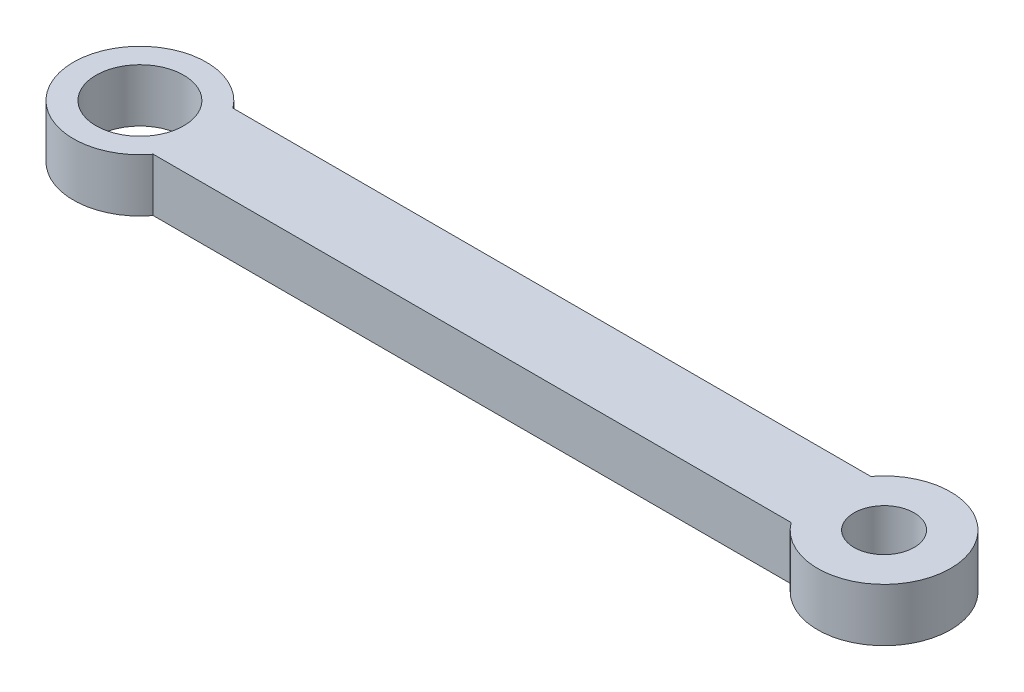
ISO-10303-21;
HEADER;
FILE_DESCRIPTION(('STEP AP214'),'2;1');
FILE_NAME('part.step','',(''),(''),'','','');
FILE_SCHEMA(('AUTOMOTIVE_DESIGN { 1 0 10303 214 1 1 1 1 }'));
ENDSEC;
DATA;
#1=APPLICATION_CONTEXT('core data for automotive mechanical design processes');
#2=APPLICATION_PROTOCOL_DEFINITION('international standard','automotive_design',2000,#1);
#3=PRODUCT_CONTEXT('',#1,'mechanical');
#4=PRODUCT('Part','Part','',(#3));
#5=PRODUCT_RELATED_PRODUCT_CATEGORY('part','',(#4));
#6=PRODUCT_DEFINITION_FORMATION('','',#4);
#7=PRODUCT_DEFINITION_CONTEXT('part definition',#1,'design');
#8=PRODUCT_DEFINITION('design','',#6,#7);
#9=PRODUCT_DEFINITION_SHAPE('','',#8);
#10=(LENGTH_UNIT() NAMED_UNIT(*) SI_UNIT(.MILLI.,.METRE.));
#11=(NAMED_UNIT(*) PLANE_ANGLE_UNIT() SI_UNIT($,.RADIAN.));
#12=(NAMED_UNIT(*) SI_UNIT($,.STERADIAN.) SOLID_ANGLE_UNIT());
#13=UNCERTAINTY_MEASURE_WITH_UNIT(LENGTH_MEASURE(1.E-05),#10,'distance_accuracy_value','');
#14=(GEOMETRIC_REPRESENTATION_CONTEXT(3) GLOBAL_UNCERTAINTY_ASSIGNED_CONTEXT((#13)) GLOBAL_UNIT_ASSIGNED_CONTEXT((#10,
#11,#12)) REPRESENTATION_CONTEXT('',''));
#15=CARTESIAN_POINT('',(0.,0.,0.));
#16=DIRECTION('',(0.,0.,1.));
#17=DIRECTION('',(1.,0.,0.));
#18=AXIS2_PLACEMENT_3D('',#15,#16,#17);
#19=CARTESIAN_POINT('',(-14.,2.,0.));
#20=DIRECTION('',(0.,1.,0.));
#21=DIRECTION('',(0.,0.,1.));
#22=AXIS2_PLACEMENT_3D('',#19,#20,#21);
#23=PLANE('',#22);
#24=CARTESIAN_POINT('',(-14.,2.,0.));
#25=DIRECTION('',(0.,1.,0.));
#26=DIRECTION('',(0.,0.,1.));
#27=AXIS2_PLACEMENT_3D('',#24,#25,#26);
#28=CIRCLE('',#27,1.65);
#29=CARTESIAN_POINT('',(-14.,2.,1.65));
#30=VERTEX_POINT('',#29);
#31=EDGE_CURVE('E100',#30,#30,#28,.T.);
#32=ORIENTED_EDGE('',*,*,#31,.F.);
#33=EDGE_LOOP('',(#32));
#34=FACE_BOUND('',#33,.T.);
#35=CARTESIAN_POINT('',(-14.,2.,0.));
#36=DIRECTION('',(0.,1.,0.));
#37=DIRECTION('',(0.,0.,1.));
#38=AXIS2_PLACEMENT_3D('',#35,#36,#37);
#39=CIRCLE('',#38,2.5);
#40=CARTESIAN_POINT('',(-12.,2.,-1.5));
#41=VERTEX_POINT('',#40);
#42=CARTESIAN_POINT('',(-12.,2.,1.5));
#43=VERTEX_POINT('',#42);
#44=EDGE_CURVE('E85',#41,#43,#39,.T.);
#45=ORIENTED_EDGE('',*,*,#44,.T.);
#46=DIRECTION('',(1.,0.,0.));
#47=VECTOR('',#46,1.);
#48=CARTESIAN_POINT('',(-12.,2.,1.5));
#49=LINE('',#48,#47);
#50=CARTESIAN_POINT('',(12.,2.,1.5));
#51=VERTEX_POINT('',#50);
#52=EDGE_CURVE('E80',#43,#51,#49,.T.);
#53=ORIENTED_EDGE('',*,*,#52,.T.);
#54=CARTESIAN_POINT('',(14.,2.,0.));
#55=DIRECTION('',(0.,1.,0.));
#56=DIRECTION('',(0.,0.,-1.));
#57=AXIS2_PLACEMENT_3D('',#54,#55,#56);
#58=CIRCLE('',#57,2.5);
#59=CARTESIAN_POINT('',(12.,2.,-1.50000000000001));
#60=VERTEX_POINT('',#59);
#61=EDGE_CURVE('E83',#51,#60,#58,.T.);
#62=ORIENTED_EDGE('',*,*,#61,.T.);
#63=DIRECTION('',(-1.,0.,0.));
#64=VECTOR('',#63,1.);
#65=CARTESIAN_POINT('',(-12.,2.,-1.5));
#66=LINE('',#65,#64);
#67=EDGE_CURVE('E50',#60,#41,#66,.T.);
#68=ORIENTED_EDGE('',*,*,#67,.T.);
#69=EDGE_LOOP('',(#45,#53,#62,#68));
#70=FACE_BOUND('',#69,.T.);
#71=CARTESIAN_POINT('',(14.,2.,0.));
#72=DIRECTION('',(0.,1.,0.));
#73=DIRECTION('',(0.,0.,1.));
#74=AXIS2_PLACEMENT_3D('',#71,#72,#73);
#75=CIRCLE('',#74,1.1303);
#76=CARTESIAN_POINT('',(14.,2.,1.1303));
#77=VERTEX_POINT('',#76);
#78=EDGE_CURVE('E115',#77,#77,#75,.T.);
#79=ORIENTED_EDGE('',*,*,#78,.F.);
#80=EDGE_LOOP('',(#79));
#81=FACE_BOUND('',#80,.T.);
#82=ADVANCED_FACE('F33',(#34,#70,#81),#23,.T.);
#83=CARTESIAN_POINT('',(-14.,0.,0.));
#84=DIRECTION('',(0.,1.,0.));
#85=DIRECTION('',(0.,0.,1.));
#86=AXIS2_PLACEMENT_3D('',#83,#84,#85);
#87=PLANE('',#86);
#88=CARTESIAN_POINT('',(-14.,0.,0.));
#89=DIRECTION('',(0.,1.,0.));
#90=DIRECTION('',(0.,0.,1.));
#91=AXIS2_PLACEMENT_3D('',#88,#89,#90);
#92=CIRCLE('',#91,2.5);
#93=CARTESIAN_POINT('',(-12.,0.,-1.5));
#94=VERTEX_POINT('',#93);
#95=CARTESIAN_POINT('',(-12.,0.,1.5));
#96=VERTEX_POINT('',#95);
#97=EDGE_CURVE('E97',#94,#96,#92,.T.);
#98=ORIENTED_EDGE('',*,*,#97,.F.);
#99=DIRECTION('',(-1.,0.,0.));
#100=VECTOR('',#99,1.);
#101=CARTESIAN_POINT('',(-12.,0.,-1.5));
#102=LINE('',#101,#100);
#103=CARTESIAN_POINT('',(12.,0.,-1.50000000000001));
#104=VERTEX_POINT('',#103);
#105=EDGE_CURVE('E73',#104,#94,#102,.T.);
#106=ORIENTED_EDGE('',*,*,#105,.F.);
#107=CARTESIAN_POINT('',(14.,0.,0.));
#108=DIRECTION('',(0.,1.,0.));
#109=DIRECTION('',(0.,0.,-1.));
#110=AXIS2_PLACEMENT_3D('',#107,#108,#109);
#111=CIRCLE('',#110,2.5);
#112=CARTESIAN_POINT('',(12.,0.,1.5));
#113=VERTEX_POINT('',#112);
#114=EDGE_CURVE('E67',#113,#104,#111,.T.);
#115=ORIENTED_EDGE('',*,*,#114,.F.);
#116=DIRECTION('',(1.,0.,0.));
#117=VECTOR('',#116,1.);
#118=CARTESIAN_POINT('',(-12.,0.,1.5));
#119=LINE('',#118,#117);
#120=EDGE_CURVE('E89',#96,#113,#119,.T.);
#121=ORIENTED_EDGE('',*,*,#120,.F.);
#122=EDGE_LOOP('',(#98,#106,#115,#121));
#123=FACE_BOUND('',#122,.T.);
#124=CARTESIAN_POINT('',(-14.,0.,0.));
#125=DIRECTION('',(0.,1.,0.));
#126=DIRECTION('',(0.,0.,1.));
#127=AXIS2_PLACEMENT_3D('',#124,#125,#126);
#128=CIRCLE('',#127,1.65);
#129=CARTESIAN_POINT('',(-14.,0.,1.65));
#130=VERTEX_POINT('',#129);
#131=EDGE_CURVE('E112',#130,#130,#128,.T.);
#132=ORIENTED_EDGE('',*,*,#131,.T.);
#133=EDGE_LOOP('',(#132));
#134=FACE_BOUND('',#133,.T.);
#135=CARTESIAN_POINT('',(14.,0.,0.));
#136=DIRECTION('',(0.,1.,0.));
#137=DIRECTION('',(0.,0.,1.));
#138=AXIS2_PLACEMENT_3D('',#135,#136,#137);
#139=CIRCLE('',#138,1.1303);
#140=CARTESIAN_POINT('',(14.,0.,1.1303));
#141=VERTEX_POINT('',#140);
#142=EDGE_CURVE('E118',#141,#141,#139,.T.);
#143=ORIENTED_EDGE('',*,*,#142,.T.);
#144=EDGE_LOOP('',(#143));
#145=FACE_BOUND('',#144,.T.);
#146=ADVANCED_FACE('F108',(#123,#134,#145),#87,.F.);
#147=CARTESIAN_POINT('',(-14.,2.,0.));
#148=DIRECTION('',(0.,-1.,0.));
#149=DIRECTION('',(0.,0.,-1.));
#150=AXIS2_PLACEMENT_3D('',#147,#148,#149);
#151=CYLINDRICAL_SURFACE('',#150,2.5);
#152=ORIENTED_EDGE('',*,*,#97,.T.);
#153=DIRECTION('',(0.,-1.,0.));
#154=VECTOR('',#153,1.);
#155=CARTESIAN_POINT('',(-12.,2.,1.5));
#156=LINE('',#155,#154);
#157=EDGE_CURVE('E11',#43,#96,#156,.T.);
#158=ORIENTED_EDGE('',*,*,#157,.F.);
#159=ORIENTED_EDGE('',*,*,#44,.F.);
#160=DIRECTION('',(0.,-1.,0.));
#161=VECTOR('',#160,1.);
#162=CARTESIAN_POINT('',(-12.,2.,-1.5));
#163=LINE('',#162,#161);
#164=EDGE_CURVE('E93',#41,#94,#163,.T.);
#165=ORIENTED_EDGE('',*,*,#164,.T.);
#166=EDGE_LOOP('',(#152,#158,#159,#165));
#167=FACE_BOUND('',#166,.T.);
#168=ADVANCED_FACE('F35',(#167),#151,.T.);
#169=CARTESIAN_POINT('',(-12.,2.,1.5));
#170=DIRECTION('',(0.,0.,-1.));
#171=DIRECTION('',(-1.,0.,0.));
#172=AXIS2_PLACEMENT_3D('',#169,#170,#171);
#173=PLANE('',#172);
#174=ORIENTED_EDGE('',*,*,#120,.T.);
#175=DIRECTION('',(0.,-1.,0.));
#176=VECTOR('',#175,1.);
#177=CARTESIAN_POINT('',(12.,2.,1.5));
#178=LINE('',#177,#176);
#179=EDGE_CURVE('E42',#51,#113,#178,.T.);
#180=ORIENTED_EDGE('',*,*,#179,.F.);
#181=ORIENTED_EDGE('',*,*,#52,.F.);
#182=ORIENTED_EDGE('',*,*,#157,.T.);
#183=EDGE_LOOP('',(#174,#180,#181,#182));
#184=FACE_BOUND('',#183,.T.);
#185=ADVANCED_FACE('F88',(#184),#173,.F.);
#186=CARTESIAN_POINT('',(14.,2.,0.));
#187=DIRECTION('',(0.,-1.,0.));
#188=DIRECTION('',(0.,0.,-1.));
#189=AXIS2_PLACEMENT_3D('',#186,#187,#188);
#190=CYLINDRICAL_SURFACE('',#189,2.5);
#191=ORIENTED_EDGE('',*,*,#114,.T.);
#192=DIRECTION('',(0.,-1.,0.));
#193=VECTOR('',#192,1.);
#194=CARTESIAN_POINT('',(12.,2.,-1.50000000000001));
#195=LINE('',#194,#193);
#196=EDGE_CURVE('E90',#60,#104,#195,.T.);
#197=ORIENTED_EDGE('',*,*,#196,.F.);
#198=ORIENTED_EDGE('',*,*,#61,.F.);
#199=ORIENTED_EDGE('',*,*,#179,.T.);
#200=EDGE_LOOP('',(#191,#197,#198,#199));
#201=FACE_BOUND('',#200,.T.);
#202=ADVANCED_FACE('F91',(#201),#190,.T.);
#203=CARTESIAN_POINT('',(-12.,2.,-1.5));
#204=DIRECTION('',(0.,0.,1.));
#205=DIRECTION('',(1.,0.,0.));
#206=AXIS2_PLACEMENT_3D('',#203,#204,#205);
#207=PLANE('',#206);
#208=ORIENTED_EDGE('',*,*,#105,.T.);
#209=ORIENTED_EDGE('',*,*,#164,.F.);
#210=ORIENTED_EDGE('',*,*,#67,.F.);
#211=ORIENTED_EDGE('',*,*,#196,.T.);
#212=EDGE_LOOP('',(#208,#209,#210,#211));
#213=FACE_BOUND('',#212,.T.);
#214=ADVANCED_FACE('F105',(#213),#207,.F.);
#215=CARTESIAN_POINT('',(-14.,2.,0.));
#216=DIRECTION('',(0.,-1.,0.));
#217=DIRECTION('',(0.,0.,-1.));
#218=AXIS2_PLACEMENT_3D('',#215,#216,#217);
#219=CYLINDRICAL_SURFACE('',#218,1.65);
#220=ORIENTED_EDGE('',*,*,#31,.T.);
#221=EDGE_LOOP('',(#220));
#222=FACE_BOUND('',#221,.T.);
#223=ORIENTED_EDGE('',*,*,#131,.F.);
#224=EDGE_LOOP('',(#223));
#225=FACE_BOUND('',#224,.T.);
#226=ADVANCED_FACE('F135',(#222,#225),#219,.F.);
#227=CARTESIAN_POINT('',(14.,2.,0.));
#228=DIRECTION('',(0.,-1.,0.));
#229=DIRECTION('',(0.,0.,-1.));
#230=AXIS2_PLACEMENT_3D('',#227,#228,#229);
#231=CYLINDRICAL_SURFACE('',#230,1.1303);
#232=ORIENTED_EDGE('',*,*,#78,.T.);
#233=EDGE_LOOP('',(#232));
#234=FACE_BOUND('',#233,.T.);
#235=ORIENTED_EDGE('',*,*,#142,.F.);
#236=EDGE_LOOP('',(#235));
#237=FACE_BOUND('',#236,.T.);
#238=ADVANCED_FACE('F124',(#234,#237),#231,.F.);
#239=CLOSED_SHELL('',(#82,#146,#168,#185,#202,#214,#226,#238));
#240=MANIFOLD_SOLID_BREP('B2',#239);
#241=ADVANCED_BREP_SHAPE_REPRESENTATION('',(#18,#240),#14);
#242=SHAPE_DEFINITION_REPRESENTATION(#9,#241);
ENDSEC;
END-ISO-10303-21;
